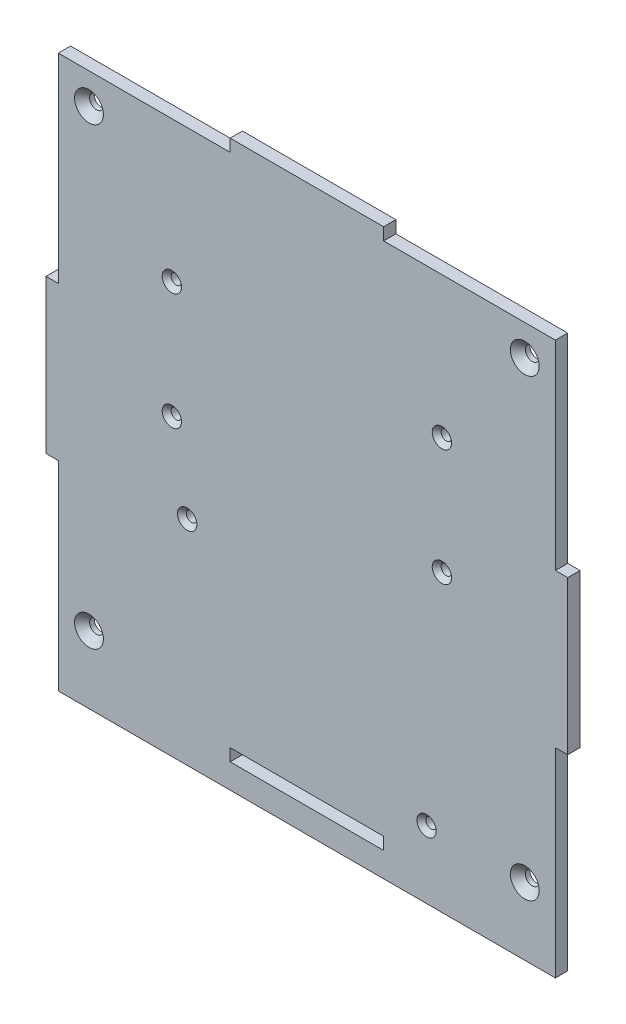
ISO-10303-21;
HEADER;
FILE_DESCRIPTION(('STEP AP214'),'2;1');
FILE_NAME('part.step','',(''),(''),'','','');
FILE_SCHEMA(('AUTOMOTIVE_DESIGN { 1 0 10303 214 1 1 1 1 }'));
ENDSEC;
DATA;
#1=APPLICATION_CONTEXT('core data for automotive mechanical design processes');
#2=APPLICATION_PROTOCOL_DEFINITION('international standard','automotive_design',2000,#1);
#3=PRODUCT_CONTEXT('',#1,'mechanical');
#4=PRODUCT('Part','Part','',(#3));
#5=PRODUCT_RELATED_PRODUCT_CATEGORY('part','',(#4));
#6=PRODUCT_DEFINITION_FORMATION('','',#4);
#7=PRODUCT_DEFINITION_CONTEXT('part definition',#1,'design');
#8=PRODUCT_DEFINITION('design','',#6,#7);
#9=PRODUCT_DEFINITION_SHAPE('','',#8);
#10=(LENGTH_UNIT() NAMED_UNIT(*) SI_UNIT(.MILLI.,.METRE.));
#11=(NAMED_UNIT(*) PLANE_ANGLE_UNIT() SI_UNIT($,.RADIAN.));
#12=(NAMED_UNIT(*) SI_UNIT($,.STERADIAN.) SOLID_ANGLE_UNIT());
#13=UNCERTAINTY_MEASURE_WITH_UNIT(LENGTH_MEASURE(1.E-05),#10,'distance_accuracy_value','');
#14=(GEOMETRIC_REPRESENTATION_CONTEXT(3) GLOBAL_UNCERTAINTY_ASSIGNED_CONTEXT((#13)) GLOBAL_UNIT_ASSIGNED_CONTEXT((#10,
#11,#12)) REPRESENTATION_CONTEXT('',''));
#15=CARTESIAN_POINT('',(0.,0.,0.));
#16=DIRECTION('',(0.,0.,1.));
#17=DIRECTION('',(1.,0.,0.));
#18=AXIS2_PLACEMENT_3D('',#15,#16,#17);
#19=CARTESIAN_POINT('',(0.,0.,4.));
#20=DIRECTION('',(0.,0.,1.));
#21=DIRECTION('',(1.,0.,0.));
#22=AXIS2_PLACEMENT_3D('',#19,#20,#21);
#23=PLANE('',#22);
#24=CARTESIAN_POINT('',(-39.,-10.5,4.));
#25=DIRECTION('',(0.,0.,1.));
#26=DIRECTION('',(1.,0.,0.));
#27=AXIS2_PLACEMENT_3D('',#24,#25,#26);
#28=CIRCLE('',#27,3.15);
#29=CARTESIAN_POINT('',(-35.85,-10.5,4.));
#30=VERTEX_POINT('',#29);
#31=EDGE_CURVE('E682',#30,#30,#28,.T.);
#32=ORIENTED_EDGE('',*,*,#31,.F.);
#33=EDGE_LOOP('',(#32));
#34=FACE_BOUND('',#33,.T.);
#35=CARTESIAN_POINT('',(39.,-58.,4.));
#36=DIRECTION('',(0.,0.,1.));
#37=DIRECTION('',(1.,0.,0.));
#38=AXIS2_PLACEMENT_3D('',#35,#36,#37);
#39=CIRCLE('',#38,3.15);
#40=CARTESIAN_POINT('',(42.15,-58.,4.));
#41=VERTEX_POINT('',#40);
#42=EDGE_CURVE('E673',#41,#41,#39,.T.);
#43=ORIENTED_EDGE('',*,*,#42,.F.);
#44=EDGE_LOOP('',(#43));
#45=FACE_BOUND('',#44,.T.);
#46=CARTESIAN_POINT('',(-71.,90.,4.));
#47=DIRECTION('',(0.,0.,1.));
#48=DIRECTION('',(1.,0.,0.));
#49=AXIS2_PLACEMENT_3D('',#46,#47,#48);
#50=CIRCLE('',#49,4.7);
#51=CARTESIAN_POINT('',(-66.3,90.,4.));
#52=VERTEX_POINT('',#51);
#53=EDGE_CURVE('E664',#52,#52,#50,.T.);
#54=ORIENTED_EDGE('',*,*,#53,.F.);
#55=EDGE_LOOP('',(#54));
#56=FACE_BOUND('',#55,.T.);
#57=CARTESIAN_POINT('',(71.,90.,4.));
#58=DIRECTION('',(0.,0.,1.));
#59=DIRECTION('',(1.,0.,0.));
#60=AXIS2_PLACEMENT_3D('',#57,#58,#59);
#61=CIRCLE('',#60,4.7);
#62=CARTESIAN_POINT('',(75.7,90.,4.));
#63=VERTEX_POINT('',#62);
#64=EDGE_CURVE('E655',#63,#63,#61,.T.);
#65=ORIENTED_EDGE('',*,*,#64,.F.);
#66=EDGE_LOOP('',(#65));
#67=FACE_BOUND('',#66,.T.);
#68=CARTESIAN_POINT('',(71.,-58.,4.));
#69=DIRECTION('',(0.,0.,1.));
#70=DIRECTION('',(1.,0.,0.));
#71=AXIS2_PLACEMENT_3D('',#68,#69,#70);
#72=CIRCLE('',#71,4.7);
#73=CARTESIAN_POINT('',(75.7,-58.,4.));
#74=VERTEX_POINT('',#73);
#75=EDGE_CURVE('E646',#74,#74,#72,.T.);
#76=ORIENTED_EDGE('',*,*,#75,.F.);
#77=EDGE_LOOP('',(#76));
#78=FACE_BOUND('',#77,.T.);
#79=CARTESIAN_POINT('',(-71.,-58.,4.));
#80=DIRECTION('',(0.,0.,1.));
#81=DIRECTION('',(1.,0.,0.));
#82=AXIS2_PLACEMENT_3D('',#79,#80,#81);
#83=CIRCLE('',#82,4.7);
#84=CARTESIAN_POINT('',(-66.3,-58.,4.));
#85=VERTEX_POINT('',#84);
#86=EDGE_CURVE('E637',#85,#85,#83,.T.);
#87=ORIENTED_EDGE('',*,*,#86,.F.);
#88=EDGE_LOOP('',(#87));
#89=FACE_BOUND('',#88,.T.);
#90=CARTESIAN_POINT('',(-44.,54.,4.));
#91=DIRECTION('',(0.,0.,1.));
#92=DIRECTION('',(1.,0.,0.));
#93=AXIS2_PLACEMENT_3D('',#90,#91,#92);
#94=CIRCLE('',#93,3.15);
#95=CARTESIAN_POINT('',(-40.85,54.,4.));
#96=VERTEX_POINT('',#95);
#97=EDGE_CURVE('E628',#96,#96,#94,.T.);
#98=ORIENTED_EDGE('',*,*,#97,.F.);
#99=EDGE_LOOP('',(#98));
#100=FACE_BOUND('',#99,.T.);
#101=CARTESIAN_POINT('',(44.,54.,4.));
#102=DIRECTION('',(0.,0.,1.));
#103=DIRECTION('',(1.,0.,0.));
#104=AXIS2_PLACEMENT_3D('',#101,#102,#103);
#105=CIRCLE('',#104,3.15);
#106=CARTESIAN_POINT('',(47.15,54.,4.));
#107=VERTEX_POINT('',#106);
#108=EDGE_CURVE('E619',#107,#107,#105,.T.);
#109=ORIENTED_EDGE('',*,*,#108,.F.);
#110=EDGE_LOOP('',(#109));
#111=FACE_BOUND('',#110,.T.);
#112=CARTESIAN_POINT('',(44.,16.,4.));
#113=DIRECTION('',(0.,0.,1.));
#114=DIRECTION('',(1.,0.,0.));
#115=AXIS2_PLACEMENT_3D('',#112,#113,#114);
#116=CIRCLE('',#115,3.15);
#117=CARTESIAN_POINT('',(47.15,16.,4.));
#118=VERTEX_POINT('',#117);
#119=EDGE_CURVE('E610',#118,#118,#116,.T.);
#120=ORIENTED_EDGE('',*,*,#119,.F.);
#121=EDGE_LOOP('',(#120));
#122=FACE_BOUND('',#121,.T.);
#123=CARTESIAN_POINT('',(-44.,16.,4.));
#124=DIRECTION('',(0.,0.,1.));
#125=DIRECTION('',(1.,0.,0.));
#126=AXIS2_PLACEMENT_3D('',#123,#124,#125);
#127=CIRCLE('',#126,3.15);
#128=CARTESIAN_POINT('',(-40.85,16.,4.));
#129=VERTEX_POINT('',#128);
#130=EDGE_CURVE('E601',#129,#129,#127,.T.);
#131=ORIENTED_EDGE('',*,*,#130,.F.);
#132=EDGE_LOOP('',(#131));
#133=FACE_BOUND('',#132,.T.);
#134=DIRECTION('',(1.,0.,0.));
#135=VECTOR('',#134,1.);
#136=CARTESIAN_POINT('',(0.,-80.,4.));
#137=LINE('',#136,#135);
#138=CARTESIAN_POINT('',(-81.,-80.,4.));
#139=VERTEX_POINT('',#138);
#140=CARTESIAN_POINT('',(81.,-80.,4.));
#141=VERTEX_POINT('',#140);
#142=EDGE_CURVE('E207',#139,#141,#137,.T.);
#143=ORIENTED_EDGE('',*,*,#142,.T.);
#144=DIRECTION('',(0.,1.,0.));
#145=VECTOR('',#144,1.);
#146=CARTESIAN_POINT('',(81.,0.,4.));
#147=LINE('',#146,#145);
#148=CARTESIAN_POINT('',(81.,-15.,4.));
#149=VERTEX_POINT('',#148);
#150=EDGE_CURVE('E210',#141,#149,#147,.T.);
#151=ORIENTED_EDGE('',*,*,#150,.T.);
#152=DIRECTION('',(1.,0.,0.));
#153=VECTOR('',#152,1.);
#154=CARTESIAN_POINT('',(0.,-15.0000000000001,4.));
#155=LINE('',#154,#153);
#156=CARTESIAN_POINT('',(85.,-15.,4.));
#157=VERTEX_POINT('',#156);
#158=EDGE_CURVE('E213',#149,#157,#155,.T.);
#159=ORIENTED_EDGE('',*,*,#158,.T.);
#160=DIRECTION('',(0.,-1.,0.));
#161=VECTOR('',#160,1.);
#162=CARTESIAN_POINT('',(85.,0.,4.));
#163=LINE('',#162,#161);
#164=CARTESIAN_POINT('',(85.,35.,4.));
#165=VERTEX_POINT('',#164);
#166=EDGE_CURVE('E216',#165,#157,#163,.T.);
#167=ORIENTED_EDGE('',*,*,#166,.F.);
#168=DIRECTION('',(1.,0.,0.));
#169=VECTOR('',#168,1.);
#170=CARTESIAN_POINT('',(0.,35.0000000000001,4.));
#171=LINE('',#170,#169);
#172=CARTESIAN_POINT('',(81.,35.,4.));
#173=VERTEX_POINT('',#172);
#174=EDGE_CURVE('E219',#173,#165,#171,.T.);
#175=ORIENTED_EDGE('',*,*,#174,.F.);
#176=CARTESIAN_POINT('',(81.,100.,4.));
#177=VERTEX_POINT('',#176);
#178=EDGE_CURVE('E214',#173,#177,#147,.T.);
#179=ORIENTED_EDGE('',*,*,#178,.T.);
#180=DIRECTION('',(1.,0.,0.));
#181=VECTOR('',#180,1.);
#182=CARTESIAN_POINT('',(0.,100.,4.));
#183=LINE('',#182,#181);
#184=CARTESIAN_POINT('',(25.,100.,4.));
#185=VERTEX_POINT('',#184);
#186=EDGE_CURVE('E222',#185,#177,#183,.T.);
#187=ORIENTED_EDGE('',*,*,#186,.F.);
#188=DIRECTION('',(0.,1.,0.));
#189=VECTOR('',#188,1.);
#190=CARTESIAN_POINT('',(25.,0.,4.));
#191=LINE('',#190,#189);
#192=CARTESIAN_POINT('',(25.,104.,4.));
#193=VERTEX_POINT('',#192);
#194=EDGE_CURVE('E225',#185,#193,#191,.T.);
#195=ORIENTED_EDGE('',*,*,#194,.T.);
#196=DIRECTION('',(1.,0.,0.));
#197=VECTOR('',#196,1.);
#198=CARTESIAN_POINT('',(0.,104.,4.));
#199=LINE('',#198,#197);
#200=CARTESIAN_POINT('',(-25.,104.,4.));
#201=VERTEX_POINT('',#200);
#202=EDGE_CURVE('E228',#201,#193,#199,.T.);
#203=ORIENTED_EDGE('',*,*,#202,.F.);
#204=DIRECTION('',(0.,1.,0.));
#205=VECTOR('',#204,1.);
#206=CARTESIAN_POINT('',(-25.,0.,4.));
#207=LINE('',#206,#205);
#208=CARTESIAN_POINT('',(-25.,100.,4.));
#209=VERTEX_POINT('',#208);
#210=EDGE_CURVE('E231',#209,#201,#207,.T.);
#211=ORIENTED_EDGE('',*,*,#210,.F.);
#212=CARTESIAN_POINT('',(-81.,100.,4.));
#213=VERTEX_POINT('',#212);
#214=EDGE_CURVE('E226',#213,#209,#183,.T.);
#215=ORIENTED_EDGE('',*,*,#214,.F.);
#216=DIRECTION('',(0.,1.,0.));
#217=VECTOR('',#216,1.);
#218=CARTESIAN_POINT('',(-81.,0.,4.));
#219=LINE('',#218,#217);
#220=CARTESIAN_POINT('',(-81.,35.,4.));
#221=VERTEX_POINT('',#220);
#222=EDGE_CURVE('E234',#221,#213,#219,.T.);
#223=ORIENTED_EDGE('',*,*,#222,.F.);
#224=DIRECTION('',(-1.,0.,0.));
#225=VECTOR('',#224,1.);
#226=CARTESIAN_POINT('',(0.,35.,4.));
#227=LINE('',#226,#225);
#228=CARTESIAN_POINT('',(-85.,35.,4.));
#229=VERTEX_POINT('',#228);
#230=EDGE_CURVE('E237',#221,#229,#227,.T.);
#231=ORIENTED_EDGE('',*,*,#230,.T.);
#232=DIRECTION('',(0.,-1.,0.));
#233=VECTOR('',#232,1.);
#234=CARTESIAN_POINT('',(-85.,0.,4.));
#235=LINE('',#234,#233);
#236=CARTESIAN_POINT('',(-85.,-15.,4.));
#237=VERTEX_POINT('',#236);
#238=EDGE_CURVE('E240',#229,#237,#235,.T.);
#239=ORIENTED_EDGE('',*,*,#238,.T.);
#240=DIRECTION('',(-1.,0.,0.));
#241=VECTOR('',#240,1.);
#242=CARTESIAN_POINT('',(0.,-15.0000000000001,4.));
#243=LINE('',#242,#241);
#244=CARTESIAN_POINT('',(-81.,-15.,4.));
#245=VERTEX_POINT('',#244);
#246=EDGE_CURVE('E242',#245,#237,#243,.T.);
#247=ORIENTED_EDGE('',*,*,#246,.F.);
#248=EDGE_CURVE('E238',#139,#245,#219,.T.);
#249=ORIENTED_EDGE('',*,*,#248,.F.);
#250=EDGE_LOOP('',(#143,#151,#159,#167,#175,#179,#187,#195,#203,#211,#215,#223,#231,#239,#247,#249));
#251=FACE_BOUND('',#250,.T.);
#252=DIRECTION('',(1.,0.,0.));
#253=VECTOR('',#252,1.);
#254=CARTESIAN_POINT('',(-25.,-72.,4.));
#255=LINE('',#254,#253);
#256=CARTESIAN_POINT('',(-25.,-72.,4.));
#257=VERTEX_POINT('',#256);
#258=CARTESIAN_POINT('',(25.,-72.,4.));
#259=VERTEX_POINT('',#258);
#260=EDGE_CURVE('E179',#257,#259,#255,.T.);
#261=ORIENTED_EDGE('',*,*,#260,.F.);
#262=DIRECTION('',(0.,1.,0.));
#263=VECTOR('',#262,1.);
#264=CARTESIAN_POINT('',(-25.,-72.,4.));
#265=LINE('',#264,#263);
#266=CARTESIAN_POINT('',(-25.,-68.,4.));
#267=VERTEX_POINT('',#266);
#268=EDGE_CURVE('E49',#257,#267,#265,.T.);
#269=ORIENTED_EDGE('',*,*,#268,.T.);
#270=DIRECTION('',(1.,0.,0.));
#271=VECTOR('',#270,1.);
#272=CARTESIAN_POINT('',(-25.,-68.,4.));
#273=LINE('',#272,#271);
#274=CARTESIAN_POINT('',(25.,-68.,4.));
#275=VERTEX_POINT('',#274);
#276=EDGE_CURVE('E192',#267,#275,#273,.T.);
#277=ORIENTED_EDGE('',*,*,#276,.T.);
#278=DIRECTION('',(0.,1.,0.));
#279=VECTOR('',#278,1.);
#280=CARTESIAN_POINT('',(25.,-72.,4.));
#281=LINE('',#280,#279);
#282=EDGE_CURVE('E199',#259,#275,#281,.T.);
#283=ORIENTED_EDGE('',*,*,#282,.F.);
#284=EDGE_LOOP('',(#261,#269,#277,#283));
#285=FACE_BOUND('',#284,.T.);
#286=ADVANCED_FACE('F34',(#34,#45,#56,#67,#78,#89,#100,#111,#122,#133,#251,#285),#23,.T.);
#287=CARTESIAN_POINT('',(0.,0.,0.));
#288=DIRECTION('',(0.,0.,1.));
#289=DIRECTION('',(1.,0.,0.));
#290=AXIS2_PLACEMENT_3D('',#287,#288,#289);
#291=PLANE('',#290);
#292=CARTESIAN_POINT('',(-39.,-10.5,0.));
#293=DIRECTION('',(0.,0.,1.));
#294=DIRECTION('',(1.,0.,0.));
#295=AXIS2_PLACEMENT_3D('',#292,#293,#294);
#296=CIRCLE('',#295,1.69999999999999);
#297=CARTESIAN_POINT('',(-37.3,-10.5,0.));
#298=VERTEX_POINT('',#297);
#299=EDGE_CURVE('E676',#298,#298,#296,.T.);
#300=ORIENTED_EDGE('',*,*,#299,.T.);
#301=EDGE_LOOP('',(#300));
#302=FACE_BOUND('',#301,.T.);
#303=CARTESIAN_POINT('',(39.,-58.,0.));
#304=DIRECTION('',(0.,0.,1.));
#305=DIRECTION('',(1.,0.,0.));
#306=AXIS2_PLACEMENT_3D('',#303,#304,#305);
#307=CIRCLE('',#306,1.69999999999999);
#308=CARTESIAN_POINT('',(40.7,-58.,0.));
#309=VERTEX_POINT('',#308);
#310=EDGE_CURVE('E667',#309,#309,#307,.T.);
#311=ORIENTED_EDGE('',*,*,#310,.T.);
#312=EDGE_LOOP('',(#311));
#313=FACE_BOUND('',#312,.T.);
#314=CARTESIAN_POINT('',(-71.,90.,0.));
#315=DIRECTION('',(0.,0.,1.));
#316=DIRECTION('',(1.,0.,0.));
#317=AXIS2_PLACEMENT_3D('',#314,#315,#316);
#318=CIRCLE('',#317,2.25);
#319=CARTESIAN_POINT('',(-68.75,90.,0.));
#320=VERTEX_POINT('',#319);
#321=EDGE_CURVE('E658',#320,#320,#318,.T.);
#322=ORIENTED_EDGE('',*,*,#321,.T.);
#323=EDGE_LOOP('',(#322));
#324=FACE_BOUND('',#323,.T.);
#325=CARTESIAN_POINT('',(71.,90.,0.));
#326=DIRECTION('',(0.,0.,1.));
#327=DIRECTION('',(1.,0.,0.));
#328=AXIS2_PLACEMENT_3D('',#325,#326,#327);
#329=CIRCLE('',#328,2.25);
#330=CARTESIAN_POINT('',(73.25,90.,0.));
#331=VERTEX_POINT('',#330);
#332=EDGE_CURVE('E649',#331,#331,#329,.T.);
#333=ORIENTED_EDGE('',*,*,#332,.T.);
#334=EDGE_LOOP('',(#333));
#335=FACE_BOUND('',#334,.T.);
#336=CARTESIAN_POINT('',(71.,-58.,0.));
#337=DIRECTION('',(0.,0.,1.));
#338=DIRECTION('',(1.,0.,0.));
#339=AXIS2_PLACEMENT_3D('',#336,#337,#338);
#340=CIRCLE('',#339,2.25);
#341=CARTESIAN_POINT('',(73.25,-58.,0.));
#342=VERTEX_POINT('',#341);
#343=EDGE_CURVE('E640',#342,#342,#340,.T.);
#344=ORIENTED_EDGE('',*,*,#343,.T.);
#345=EDGE_LOOP('',(#344));
#346=FACE_BOUND('',#345,.T.);
#347=CARTESIAN_POINT('',(-71.,-58.,0.));
#348=DIRECTION('',(0.,0.,1.));
#349=DIRECTION('',(1.,0.,0.));
#350=AXIS2_PLACEMENT_3D('',#347,#348,#349);
#351=CIRCLE('',#350,2.25);
#352=CARTESIAN_POINT('',(-68.75,-58.,0.));
#353=VERTEX_POINT('',#352);
#354=EDGE_CURVE('E631',#353,#353,#351,.T.);
#355=ORIENTED_EDGE('',*,*,#354,.T.);
#356=EDGE_LOOP('',(#355));
#357=FACE_BOUND('',#356,.T.);
#358=CARTESIAN_POINT('',(-44.,54.,0.));
#359=DIRECTION('',(0.,0.,1.));
#360=DIRECTION('',(1.,0.,0.));
#361=AXIS2_PLACEMENT_3D('',#358,#359,#360);
#362=CIRCLE('',#361,1.7);
#363=CARTESIAN_POINT('',(-42.3,54.,0.));
#364=VERTEX_POINT('',#363);
#365=EDGE_CURVE('E622',#364,#364,#362,.T.);
#366=ORIENTED_EDGE('',*,*,#365,.T.);
#367=EDGE_LOOP('',(#366));
#368=FACE_BOUND('',#367,.T.);
#369=CARTESIAN_POINT('',(44.,54.,0.));
#370=DIRECTION('',(0.,0.,1.));
#371=DIRECTION('',(1.,0.,0.));
#372=AXIS2_PLACEMENT_3D('',#369,#370,#371);
#373=CIRCLE('',#372,1.7);
#374=CARTESIAN_POINT('',(45.7,54.,0.));
#375=VERTEX_POINT('',#374);
#376=EDGE_CURVE('E613',#375,#375,#373,.T.);
#377=ORIENTED_EDGE('',*,*,#376,.T.);
#378=EDGE_LOOP('',(#377));
#379=FACE_BOUND('',#378,.T.);
#380=CARTESIAN_POINT('',(44.,16.,0.));
#381=DIRECTION('',(0.,0.,1.));
#382=DIRECTION('',(1.,0.,0.));
#383=AXIS2_PLACEMENT_3D('',#380,#381,#382);
#384=CIRCLE('',#383,1.7);
#385=CARTESIAN_POINT('',(45.7,16.,0.));
#386=VERTEX_POINT('',#385);
#387=EDGE_CURVE('E604',#386,#386,#384,.T.);
#388=ORIENTED_EDGE('',*,*,#387,.T.);
#389=EDGE_LOOP('',(#388));
#390=FACE_BOUND('',#389,.T.);
#391=CARTESIAN_POINT('',(-44.,16.,0.));
#392=DIRECTION('',(0.,0.,1.));
#393=DIRECTION('',(1.,0.,0.));
#394=AXIS2_PLACEMENT_3D('',#391,#392,#393);
#395=CIRCLE('',#394,1.7);
#396=CARTESIAN_POINT('',(-42.3,16.,0.));
#397=VERTEX_POINT('',#396);
#398=EDGE_CURVE('E594',#397,#397,#395,.T.);
#399=ORIENTED_EDGE('',*,*,#398,.T.);
#400=EDGE_LOOP('',(#399));
#401=FACE_BOUND('',#400,.T.);
#402=DIRECTION('',(1.,0.,0.));
#403=VECTOR('',#402,1.);
#404=CARTESIAN_POINT('',(0.,-80.,0.));
#405=LINE('',#404,#403);
#406=CARTESIAN_POINT('',(-81.,-80.,0.));
#407=VERTEX_POINT('',#406);
#408=CARTESIAN_POINT('',(81.,-80.,0.));
#409=VERTEX_POINT('',#408);
#410=EDGE_CURVE('E185',#407,#409,#405,.T.);
#411=ORIENTED_EDGE('',*,*,#410,.F.);
#412=DIRECTION('',(0.,1.,0.));
#413=VECTOR('',#412,1.);
#414=CARTESIAN_POINT('',(-81.,0.,0.));
#415=LINE('',#414,#413);
#416=CARTESIAN_POINT('',(-81.,-15.,0.));
#417=VERTEX_POINT('',#416);
#418=EDGE_CURVE('E211',#407,#417,#415,.T.);
#419=ORIENTED_EDGE('',*,*,#418,.T.);
#420=DIRECTION('',(-1.,0.,0.));
#421=VECTOR('',#420,1.);
#422=CARTESIAN_POINT('',(0.,-15.0000000000001,0.));
#423=LINE('',#422,#421);
#424=CARTESIAN_POINT('',(-85.,-15.,0.));
#425=VERTEX_POINT('',#424);
#426=EDGE_CURVE('E280',#417,#425,#423,.T.);
#427=ORIENTED_EDGE('',*,*,#426,.T.);
#428=DIRECTION('',(0.,-1.,0.));
#429=VECTOR('',#428,1.);
#430=CARTESIAN_POINT('',(-85.,0.,0.));
#431=LINE('',#430,#429);
#432=CARTESIAN_POINT('',(-85.,35.,0.));
#433=VERTEX_POINT('',#432);
#434=EDGE_CURVE('E277',#433,#425,#431,.T.);
#435=ORIENTED_EDGE('',*,*,#434,.F.);
#436=DIRECTION('',(-1.,0.,0.));
#437=VECTOR('',#436,1.);
#438=CARTESIAN_POINT('',(0.,35.,0.));
#439=LINE('',#438,#437);
#440=CARTESIAN_POINT('',(-81.,35.,0.));
#441=VERTEX_POINT('',#440);
#442=EDGE_CURVE('E275',#441,#433,#439,.T.);
#443=ORIENTED_EDGE('',*,*,#442,.F.);
#444=CARTESIAN_POINT('',(-81.,100.,0.));
#445=VERTEX_POINT('',#444);
#446=EDGE_CURVE('E272',#441,#445,#415,.T.);
#447=ORIENTED_EDGE('',*,*,#446,.T.);
#448=DIRECTION('',(1.,0.,0.));
#449=VECTOR('',#448,1.);
#450=CARTESIAN_POINT('',(0.,100.,0.));
#451=LINE('',#450,#449);
#452=CARTESIAN_POINT('',(-25.,100.,0.));
#453=VERTEX_POINT('',#452);
#454=EDGE_CURVE('E263',#445,#453,#451,.T.);
#455=ORIENTED_EDGE('',*,*,#454,.T.);
#456=DIRECTION('',(0.,1.,0.));
#457=VECTOR('',#456,1.);
#458=CARTESIAN_POINT('',(-25.,0.,0.));
#459=LINE('',#458,#457);
#460=CARTESIAN_POINT('',(-25.,104.,0.));
#461=VERTEX_POINT('',#460);
#462=EDGE_CURVE('E269',#453,#461,#459,.T.);
#463=ORIENTED_EDGE('',*,*,#462,.T.);
#464=DIRECTION('',(1.,0.,0.));
#465=VECTOR('',#464,1.);
#466=CARTESIAN_POINT('',(0.,104.,0.));
#467=LINE('',#466,#465);
#468=CARTESIAN_POINT('',(25.,104.,0.));
#469=VERTEX_POINT('',#468);
#470=EDGE_CURVE('E266',#461,#469,#467,.T.);
#471=ORIENTED_EDGE('',*,*,#470,.T.);
#472=DIRECTION('',(0.,1.,0.));
#473=VECTOR('',#472,1.);
#474=CARTESIAN_POINT('',(25.,0.,0.));
#475=LINE('',#474,#473);
#476=CARTESIAN_POINT('',(25.,100.,0.));
#477=VERTEX_POINT('',#476);
#478=EDGE_CURVE('E262',#477,#469,#475,.T.);
#479=ORIENTED_EDGE('',*,*,#478,.F.);
#480=CARTESIAN_POINT('',(81.,100.,0.));
#481=VERTEX_POINT('',#480);
#482=EDGE_CURVE('E259',#477,#481,#451,.T.);
#483=ORIENTED_EDGE('',*,*,#482,.T.);
#484=DIRECTION('',(0.,1.,0.));
#485=VECTOR('',#484,1.);
#486=CARTESIAN_POINT('',(81.,0.,0.));
#487=LINE('',#486,#485);
#488=CARTESIAN_POINT('',(81.,35.,0.));
#489=VERTEX_POINT('',#488);
#490=EDGE_CURVE('E250',#489,#481,#487,.T.);
#491=ORIENTED_EDGE('',*,*,#490,.F.);
#492=DIRECTION('',(1.,0.,0.));
#493=VECTOR('',#492,1.);
#494=CARTESIAN_POINT('',(0.,35.0000000000001,0.));
#495=LINE('',#494,#493);
#496=CARTESIAN_POINT('',(85.,35.,0.));
#497=VERTEX_POINT('',#496);
#498=EDGE_CURVE('E256',#489,#497,#495,.T.);
#499=ORIENTED_EDGE('',*,*,#498,.T.);
#500=DIRECTION('',(0.,-1.,0.));
#501=VECTOR('',#500,1.);
#502=CARTESIAN_POINT('',(85.,0.,0.));
#503=LINE('',#502,#501);
#504=CARTESIAN_POINT('',(85.,-15.,0.));
#505=VERTEX_POINT('',#504);
#506=EDGE_CURVE('E253',#497,#505,#503,.T.);
#507=ORIENTED_EDGE('',*,*,#506,.T.);
#508=DIRECTION('',(1.,0.,0.));
#509=VECTOR('',#508,1.);
#510=CARTESIAN_POINT('',(0.,-15.0000000000001,0.));
#511=LINE('',#510,#509);
#512=CARTESIAN_POINT('',(81.,-15.,0.));
#513=VERTEX_POINT('',#512);
#514=EDGE_CURVE('E249',#513,#505,#511,.T.);
#515=ORIENTED_EDGE('',*,*,#514,.F.);
#516=EDGE_CURVE('E247',#409,#513,#487,.T.);
#517=ORIENTED_EDGE('',*,*,#516,.F.);
#518=EDGE_LOOP('',(#411,#419,#427,#435,#443,#447,#455,#463,#471,#479,#483,#491,#499,#507,#515,#517));
#519=FACE_BOUND('',#518,.T.);
#520=DIRECTION('',(0.,-1.,0.));
#521=VECTOR('',#520,1.);
#522=CARTESIAN_POINT('',(-25.,-72.,0.));
#523=LINE('',#522,#521);
#524=CARTESIAN_POINT('',(-25.,-68.,0.));
#525=VERTEX_POINT('',#524);
#526=CARTESIAN_POINT('',(-25.,-72.,0.));
#527=VERTEX_POINT('',#526);
#528=EDGE_CURVE('E173',#525,#527,#523,.T.);
#529=ORIENTED_EDGE('',*,*,#528,.T.);
#530=DIRECTION('',(-1.,0.,0.));
#531=VECTOR('',#530,1.);
#532=CARTESIAN_POINT('',(-25.,-72.,0.));
#533=LINE('',#532,#531);
#534=CARTESIAN_POINT('',(25.,-72.,0.));
#535=VERTEX_POINT('',#534);
#536=EDGE_CURVE('E182',#535,#527,#533,.T.);
#537=ORIENTED_EDGE('',*,*,#536,.F.);
#538=DIRECTION('',(0.,-1.,0.));
#539=VECTOR('',#538,1.);
#540=CARTESIAN_POINT('',(25.,-72.,0.));
#541=LINE('',#540,#539);
#542=CARTESIAN_POINT('',(25.,-68.,0.));
#543=VERTEX_POINT('',#542);
#544=EDGE_CURVE('E57',#543,#535,#541,.T.);
#545=ORIENTED_EDGE('',*,*,#544,.F.);
#546=DIRECTION('',(-1.,0.,0.));
#547=VECTOR('',#546,1.);
#548=CARTESIAN_POINT('',(-25.,-68.,0.));
#549=LINE('',#548,#547);
#550=EDGE_CURVE('E190',#543,#525,#549,.T.);
#551=ORIENTED_EDGE('',*,*,#550,.T.);
#552=EDGE_LOOP('',(#529,#537,#545,#551));
#553=FACE_BOUND('',#552,.T.);
#554=ADVANCED_FACE('F188',(#302,#313,#324,#335,#346,#357,#368,#379,#390,#401,#519,#553),#291,.F.);
#555=CARTESIAN_POINT('',(0.,-80.,4.));
#556=DIRECTION('',(0.,1.,0.));
#557=DIRECTION('',(0.,0.,1.));
#558=AXIS2_PLACEMENT_3D('',#555,#556,#557);
#559=PLANE('',#558);
#560=ORIENTED_EDGE('',*,*,#410,.T.);
#561=DIRECTION('',(0.,0.,-1.));
#562=VECTOR('',#561,1.);
#563=CARTESIAN_POINT('',(81.,-80.,4.));
#564=LINE('',#563,#562);
#565=EDGE_CURVE('E11',#141,#409,#564,.T.);
#566=ORIENTED_EDGE('',*,*,#565,.F.);
#567=ORIENTED_EDGE('',*,*,#142,.F.);
#568=DIRECTION('',(0.,0.,-1.));
#569=VECTOR('',#568,1.);
#570=CARTESIAN_POINT('',(-81.,-80.,4.));
#571=LINE('',#570,#569);
#572=EDGE_CURVE('E283',#139,#407,#571,.T.);
#573=ORIENTED_EDGE('',*,*,#572,.T.);
#574=EDGE_LOOP('',(#560,#566,#567,#573));
#575=FACE_BOUND('',#574,.T.);
#576=ADVANCED_FACE('F36',(#575),#559,.F.);
#577=CARTESIAN_POINT('',(81.,0.,4.));
#578=DIRECTION('',(-1.,0.,0.));
#579=DIRECTION('',(0.,0.,1.));
#580=AXIS2_PLACEMENT_3D('',#577,#578,#579);
#581=PLANE('',#580);
#582=ORIENTED_EDGE('',*,*,#516,.T.);
#583=DIRECTION('',(0.,0.,-1.));
#584=VECTOR('',#583,1.);
#585=CARTESIAN_POINT('',(81.,-15.,4.));
#586=LINE('',#585,#584);
#587=EDGE_CURVE('E42',#149,#513,#586,.T.);
#588=ORIENTED_EDGE('',*,*,#587,.F.);
#589=ORIENTED_EDGE('',*,*,#150,.F.);
#590=ORIENTED_EDGE('',*,*,#565,.T.);
#591=EDGE_LOOP('',(#582,#588,#589,#590));
#592=FACE_BOUND('',#591,.T.);
#593=ADVANCED_FACE('F387',(#592),#581,.F.);
#594=CARTESIAN_POINT('',(0.,-15.0000000000001,4.));
#595=DIRECTION('',(0.,1.,0.));
#596=DIRECTION('',(-1.,0.,0.));
#597=AXIS2_PLACEMENT_3D('',#594,#595,#596);
#598=PLANE('',#597);
#599=ORIENTED_EDGE('',*,*,#514,.T.);
#600=DIRECTION('',(0.,0.,-1.));
#601=VECTOR('',#600,1.);
#602=CARTESIAN_POINT('',(85.,-15.,4.));
#603=LINE('',#602,#601);
#604=EDGE_CURVE('E310',#157,#505,#603,.T.);
#605=ORIENTED_EDGE('',*,*,#604,.F.);
#606=ORIENTED_EDGE('',*,*,#158,.F.);
#607=ORIENTED_EDGE('',*,*,#587,.T.);
#608=EDGE_LOOP('',(#599,#605,#606,#607));
#609=FACE_BOUND('',#608,.T.);
#610=ADVANCED_FACE('F316',(#609),#598,.F.);
#611=CARTESIAN_POINT('',(85.,0.,4.));
#612=DIRECTION('',(1.,0.,0.));
#613=DIRECTION('',(0.,0.,-1.));
#614=AXIS2_PLACEMENT_3D('',#611,#612,#613);
#615=PLANE('',#614);
#616=ORIENTED_EDGE('',*,*,#506,.F.);
#617=DIRECTION('',(0.,0.,-1.));
#618=VECTOR('',#617,1.);
#619=CARTESIAN_POINT('',(85.,35.,4.));
#620=LINE('',#619,#618);
#621=EDGE_CURVE('E308',#165,#497,#620,.T.);
#622=ORIENTED_EDGE('',*,*,#621,.F.);
#623=ORIENTED_EDGE('',*,*,#166,.T.);
#624=ORIENTED_EDGE('',*,*,#604,.T.);
#625=EDGE_LOOP('',(#616,#622,#623,#624));
#626=FACE_BOUND('',#625,.T.);
#627=ADVANCED_FACE('F325',(#626),#615,.T.);
#628=CARTESIAN_POINT('',(0.,35.0000000000001,4.));
#629=DIRECTION('',(0.,1.,0.));
#630=DIRECTION('',(-1.,0.,0.));
#631=AXIS2_PLACEMENT_3D('',#628,#629,#630);
#632=PLANE('',#631);
#633=ORIENTED_EDGE('',*,*,#498,.F.);
#634=DIRECTION('',(0.,0.,-1.));
#635=VECTOR('',#634,1.);
#636=CARTESIAN_POINT('',(81.,35.,4.));
#637=LINE('',#636,#635);
#638=EDGE_CURVE('E306',#173,#489,#637,.T.);
#639=ORIENTED_EDGE('',*,*,#638,.F.);
#640=ORIENTED_EDGE('',*,*,#174,.T.);
#641=ORIENTED_EDGE('',*,*,#621,.T.);
#642=EDGE_LOOP('',(#633,#639,#640,#641));
#643=FACE_BOUND('',#642,.T.);
#644=ADVANCED_FACE('F331',(#643),#632,.T.);
#645=ORIENTED_EDGE('',*,*,#490,.T.);
#646=DIRECTION('',(0.,0.,-1.));
#647=VECTOR('',#646,1.);
#648=CARTESIAN_POINT('',(81.,100.,4.));
#649=LINE('',#648,#647);
#650=EDGE_CURVE('E304',#177,#481,#649,.T.);
#651=ORIENTED_EDGE('',*,*,#650,.F.);
#652=ORIENTED_EDGE('',*,*,#178,.F.);
#653=ORIENTED_EDGE('',*,*,#638,.T.);
#654=EDGE_LOOP('',(#645,#651,#652,#653));
#655=FACE_BOUND('',#654,.T.);
#656=ADVANCED_FACE('F336',(#655),#581,.F.);
#657=CARTESIAN_POINT('',(0.,100.,4.));
#658=DIRECTION('',(0.,1.,0.));
#659=DIRECTION('',(0.,0.,1.));
#660=AXIS2_PLACEMENT_3D('',#657,#658,#659);
#661=PLANE('',#660);
#662=ORIENTED_EDGE('',*,*,#482,.F.);
#663=DIRECTION('',(0.,0.,-1.));
#664=VECTOR('',#663,1.);
#665=CARTESIAN_POINT('',(25.,100.,4.));
#666=LINE('',#665,#664);
#667=EDGE_CURVE('E302',#185,#477,#666,.T.);
#668=ORIENTED_EDGE('',*,*,#667,.F.);
#669=ORIENTED_EDGE('',*,*,#186,.T.);
#670=ORIENTED_EDGE('',*,*,#650,.T.);
#671=EDGE_LOOP('',(#662,#668,#669,#670));
#672=FACE_BOUND('',#671,.T.);
#673=ADVANCED_FACE('F343',(#672),#661,.T.);
#674=CARTESIAN_POINT('',(25.,0.,4.));
#675=DIRECTION('',(-1.,0.,0.));
#676=DIRECTION('',(0.,0.,1.));
#677=AXIS2_PLACEMENT_3D('',#674,#675,#676);
#678=PLANE('',#677);
#679=ORIENTED_EDGE('',*,*,#478,.T.);
#680=DIRECTION('',(0.,0.,-1.));
#681=VECTOR('',#680,1.);
#682=CARTESIAN_POINT('',(25.,104.,4.));
#683=LINE('',#682,#681);
#684=EDGE_CURVE('E300',#193,#469,#683,.T.);
#685=ORIENTED_EDGE('',*,*,#684,.F.);
#686=ORIENTED_EDGE('',*,*,#194,.F.);
#687=ORIENTED_EDGE('',*,*,#667,.T.);
#688=EDGE_LOOP('',(#679,#685,#686,#687));
#689=FACE_BOUND('',#688,.T.);
#690=ADVANCED_FACE('F346',(#689),#678,.F.);
#691=CARTESIAN_POINT('',(0.,104.,4.));
#692=DIRECTION('',(0.,1.,0.));
#693=DIRECTION('',(0.,0.,1.));
#694=AXIS2_PLACEMENT_3D('',#691,#692,#693);
#695=PLANE('',#694);
#696=ORIENTED_EDGE('',*,*,#470,.F.);
#697=DIRECTION('',(0.,0.,-1.));
#698=VECTOR('',#697,1.);
#699=CARTESIAN_POINT('',(-25.,104.,4.));
#700=LINE('',#699,#698);
#701=EDGE_CURVE('E298',#201,#461,#700,.T.);
#702=ORIENTED_EDGE('',*,*,#701,.F.);
#703=ORIENTED_EDGE('',*,*,#202,.T.);
#704=ORIENTED_EDGE('',*,*,#684,.T.);
#705=EDGE_LOOP('',(#696,#702,#703,#704));
#706=FACE_BOUND('',#705,.T.);
#707=ADVANCED_FACE('F349',(#706),#695,.T.);
#708=CARTESIAN_POINT('',(-25.,0.,4.));
#709=DIRECTION('',(-1.,0.,0.));
#710=DIRECTION('',(0.,0.,1.));
#711=AXIS2_PLACEMENT_3D('',#708,#709,#710);
#712=PLANE('',#711);
#713=ORIENTED_EDGE('',*,*,#462,.F.);
#714=DIRECTION('',(0.,0.,-1.));
#715=VECTOR('',#714,1.);
#716=CARTESIAN_POINT('',(-25.,100.,4.));
#717=LINE('',#716,#715);
#718=EDGE_CURVE('E296',#209,#453,#717,.T.);
#719=ORIENTED_EDGE('',*,*,#718,.F.);
#720=ORIENTED_EDGE('',*,*,#210,.T.);
#721=ORIENTED_EDGE('',*,*,#701,.T.);
#722=EDGE_LOOP('',(#713,#719,#720,#721));
#723=FACE_BOUND('',#722,.T.);
#724=ADVANCED_FACE('F355',(#723),#712,.T.);
#725=ORIENTED_EDGE('',*,*,#454,.F.);
#726=DIRECTION('',(0.,0.,-1.));
#727=VECTOR('',#726,1.);
#728=CARTESIAN_POINT('',(-81.,100.,4.));
#729=LINE('',#728,#727);
#730=EDGE_CURVE('E294',#213,#445,#729,.T.);
#731=ORIENTED_EDGE('',*,*,#730,.F.);
#732=ORIENTED_EDGE('',*,*,#214,.T.);
#733=ORIENTED_EDGE('',*,*,#718,.T.);
#734=EDGE_LOOP('',(#725,#731,#732,#733));
#735=FACE_BOUND('',#734,.T.);
#736=ADVANCED_FACE('F359',(#735),#661,.T.);
#737=CARTESIAN_POINT('',(-81.,0.,4.));
#738=DIRECTION('',(-1.,0.,0.));
#739=DIRECTION('',(0.,0.,1.));
#740=AXIS2_PLACEMENT_3D('',#737,#738,#739);
#741=PLANE('',#740);
#742=ORIENTED_EDGE('',*,*,#446,.F.);
#743=DIRECTION('',(0.,0.,-1.));
#744=VECTOR('',#743,1.);
#745=CARTESIAN_POINT('',(-81.,35.,4.));
#746=LINE('',#745,#744);
#747=EDGE_CURVE('E292',#221,#441,#746,.T.);
#748=ORIENTED_EDGE('',*,*,#747,.F.);
#749=ORIENTED_EDGE('',*,*,#222,.T.);
#750=ORIENTED_EDGE('',*,*,#730,.T.);
#751=EDGE_LOOP('',(#742,#748,#749,#750));
#752=FACE_BOUND('',#751,.T.);
#753=ADVANCED_FACE('F363',(#752),#741,.T.);
#754=CARTESIAN_POINT('',(0.,35.,4.));
#755=DIRECTION('',(0.,-1.,0.));
#756=DIRECTION('',(0.,0.,-1.));
#757=AXIS2_PLACEMENT_3D('',#754,#755,#756);
#758=PLANE('',#757);
#759=ORIENTED_EDGE('',*,*,#442,.T.);
#760=DIRECTION('',(0.,0.,-1.));
#761=VECTOR('',#760,1.);
#762=CARTESIAN_POINT('',(-85.,35.,4.));
#763=LINE('',#762,#761);
#764=EDGE_CURVE('E289',#229,#433,#763,.T.);
#765=ORIENTED_EDGE('',*,*,#764,.F.);
#766=ORIENTED_EDGE('',*,*,#230,.F.);
#767=ORIENTED_EDGE('',*,*,#747,.T.);
#768=EDGE_LOOP('',(#759,#765,#766,#767));
#769=FACE_BOUND('',#768,.T.);
#770=ADVANCED_FACE('F368',(#769),#758,.F.);
#771=CARTESIAN_POINT('',(-85.,0.,4.));
#772=DIRECTION('',(1.,0.,0.));
#773=DIRECTION('',(0.,1.,0.));
#774=AXIS2_PLACEMENT_3D('',#771,#772,#773);
#775=PLANE('',#774);
#776=ORIENTED_EDGE('',*,*,#434,.T.);
#777=DIRECTION('',(0.,0.,-1.));
#778=VECTOR('',#777,1.);
#779=CARTESIAN_POINT('',(-85.,-15.,4.));
#780=LINE('',#779,#778);
#781=EDGE_CURVE('E287',#237,#425,#780,.T.);
#782=ORIENTED_EDGE('',*,*,#781,.F.);
#783=ORIENTED_EDGE('',*,*,#238,.F.);
#784=ORIENTED_EDGE('',*,*,#764,.T.);
#785=EDGE_LOOP('',(#776,#782,#783,#784));
#786=FACE_BOUND('',#785,.T.);
#787=ADVANCED_FACE('F375',(#786),#775,.F.);
#788=CARTESIAN_POINT('',(0.,-15.0000000000001,4.));
#789=DIRECTION('',(0.,-1.,0.));
#790=DIRECTION('',(1.,0.,0.));
#791=AXIS2_PLACEMENT_3D('',#788,#789,#790);
#792=PLANE('',#791);
#793=ORIENTED_EDGE('',*,*,#426,.F.);
#794=DIRECTION('',(0.,0.,-1.));
#795=VECTOR('',#794,1.);
#796=CARTESIAN_POINT('',(-81.,-15.,4.));
#797=LINE('',#796,#795);
#798=EDGE_CURVE('E285',#245,#417,#797,.T.);
#799=ORIENTED_EDGE('',*,*,#798,.F.);
#800=ORIENTED_EDGE('',*,*,#246,.T.);
#801=ORIENTED_EDGE('',*,*,#781,.T.);
#802=EDGE_LOOP('',(#793,#799,#800,#801));
#803=FACE_BOUND('',#802,.T.);
#804=ADVANCED_FACE('F379',(#803),#792,.T.);
#805=ORIENTED_EDGE('',*,*,#418,.F.);
#806=ORIENTED_EDGE('',*,*,#572,.F.);
#807=ORIENTED_EDGE('',*,*,#248,.T.);
#808=ORIENTED_EDGE('',*,*,#798,.T.);
#809=EDGE_LOOP('',(#805,#806,#807,#808));
#810=FACE_BOUND('',#809,.T.);
#811=ADVANCED_FACE('F383',(#810),#741,.T.);
#812=CARTESIAN_POINT('',(-25.,-72.,-0.00100000000000013));
#813=DIRECTION('',(1.,0.,0.));
#814=DIRECTION('',(0.,0.,-1.));
#815=AXIS2_PLACEMENT_3D('',#812,#813,#814);
#816=PLANE('',#815);
#817=DIRECTION('',(0.,0.,1.));
#818=VECTOR('',#817,1.);
#819=CARTESIAN_POINT('',(-25.,-68.,-0.00100000000000013));
#820=LINE('',#819,#818);
#821=EDGE_CURVE('E186',#525,#267,#820,.T.);
#822=ORIENTED_EDGE('',*,*,#821,.T.);
#823=ORIENTED_EDGE('',*,*,#268,.F.);
#824=DIRECTION('',(0.,0.,1.));
#825=VECTOR('',#824,1.);
#826=CARTESIAN_POINT('',(-25.,-72.,-0.00100000000000013));
#827=LINE('',#826,#825);
#828=EDGE_CURVE('E169',#527,#257,#827,.T.);
#829=ORIENTED_EDGE('',*,*,#828,.F.);
#830=ORIENTED_EDGE('',*,*,#528,.F.);
#831=EDGE_LOOP('',(#822,#823,#829,#830));
#832=FACE_BOUND('',#831,.T.);
#833=ADVANCED_FACE('F171',(#832),#816,.T.);
#834=CARTESIAN_POINT('',(-25.,-68.,-0.00100000000000013));
#835=DIRECTION('',(0.,-1.,0.));
#836=DIRECTION('',(0.,0.,-1.));
#837=AXIS2_PLACEMENT_3D('',#834,#835,#836);
#838=PLANE('',#837);
#839=DIRECTION('',(0.,0.,1.));
#840=VECTOR('',#839,1.);
#841=CARTESIAN_POINT('',(25.,-68.,-0.00100000000000013));
#842=LINE('',#841,#840);
#843=EDGE_CURVE('E204',#543,#275,#842,.T.);
#844=ORIENTED_EDGE('',*,*,#843,.T.);
#845=ORIENTED_EDGE('',*,*,#276,.F.);
#846=ORIENTED_EDGE('',*,*,#821,.F.);
#847=ORIENTED_EDGE('',*,*,#550,.F.);
#848=EDGE_LOOP('',(#844,#845,#846,#847));
#849=FACE_BOUND('',#848,.T.);
#850=ADVANCED_FACE('F586',(#849),#838,.T.);
#851=CARTESIAN_POINT('',(25.,-72.,-0.00100000000000013));
#852=DIRECTION('',(1.,0.,0.));
#853=DIRECTION('',(0.,0.,-1.));
#854=AXIS2_PLACEMENT_3D('',#851,#852,#853);
#855=PLANE('',#854);
#856=ORIENTED_EDGE('',*,*,#544,.T.);
#857=DIRECTION('',(0.,0.,1.));
#858=VECTOR('',#857,1.);
#859=CARTESIAN_POINT('',(25.,-72.,-0.00100000000000013));
#860=LINE('',#859,#858);
#861=EDGE_CURVE('E178',#535,#259,#860,.T.);
#862=ORIENTED_EDGE('',*,*,#861,.T.);
#863=ORIENTED_EDGE('',*,*,#282,.T.);
#864=ORIENTED_EDGE('',*,*,#843,.F.);
#865=EDGE_LOOP('',(#856,#862,#863,#864));
#866=FACE_BOUND('',#865,.T.);
#867=ADVANCED_FACE('F584',(#866),#855,.F.);
#868=CARTESIAN_POINT('',(-25.,-72.,-0.00100000000000013));
#869=DIRECTION('',(0.,-1.,0.));
#870=DIRECTION('',(0.,0.,-1.));
#871=AXIS2_PLACEMENT_3D('',#868,#869,#870);
#872=PLANE('',#871);
#873=ORIENTED_EDGE('',*,*,#536,.T.);
#874=ORIENTED_EDGE('',*,*,#828,.T.);
#875=ORIENTED_EDGE('',*,*,#260,.T.);
#876=ORIENTED_EDGE('',*,*,#861,.F.);
#877=EDGE_LOOP('',(#873,#874,#875,#876));
#878=FACE_BOUND('',#877,.T.);
#879=ADVANCED_FACE('F183',(#878),#872,.F.);
#880=CARTESIAN_POINT('',(-44.,16.,4.));
#881=DIRECTION('',(0.,0.,1.));
#882=DIRECTION('',(1.,0.,0.));
#883=AXIS2_PLACEMENT_3D('',#880,#881,#882);
#884=CYLINDRICAL_SURFACE('',#883,1.7);
#885=ORIENTED_EDGE('',*,*,#398,.F.);
#886=EDGE_LOOP('',(#885));
#887=FACE_BOUND('',#886,.T.);
#888=CARTESIAN_POINT('',(-44.,16.,2.55));
#889=DIRECTION('',(0.,0.,1.));
#890=DIRECTION('',(1.,0.,0.));
#891=AXIS2_PLACEMENT_3D('',#888,#889,#890);
#892=CIRCLE('',#891,1.7);
#893=CARTESIAN_POINT('',(-42.3,16.,2.55));
#894=VERTEX_POINT('',#893);
#895=EDGE_CURVE('E596',#894,#894,#892,.T.);
#896=ORIENTED_EDGE('',*,*,#895,.T.);
#897=EDGE_LOOP('',(#896));
#898=FACE_BOUND('',#897,.T.);
#899=ADVANCED_FACE('F577',(#887,#898),#884,.F.);
#900=CARTESIAN_POINT('',(-44.,16.,4.));
#901=DIRECTION('',(0.,0.,1.));
#902=DIRECTION('',(1.,0.,0.));
#903=AXIS2_PLACEMENT_3D('',#900,#901,#902);
#904=CONICAL_SURFACE('',#903,3.15,0.785398163397449);
#905=ORIENTED_EDGE('',*,*,#895,.F.);
#906=EDGE_LOOP('',(#905));
#907=FACE_BOUND('',#906,.T.);
#908=ORIENTED_EDGE('',*,*,#130,.T.);
#909=EDGE_LOOP('',(#908));
#910=FACE_BOUND('',#909,.T.);
#911=ADVANCED_FACE('F573',(#907,#910),#904,.F.);
#912=CARTESIAN_POINT('',(44.,16.,4.));
#913=DIRECTION('',(0.,0.,1.));
#914=DIRECTION('',(1.,0.,0.));
#915=AXIS2_PLACEMENT_3D('',#912,#913,#914);
#916=CYLINDRICAL_SURFACE('',#915,1.7);
#917=ORIENTED_EDGE('',*,*,#387,.F.);
#918=EDGE_LOOP('',(#917));
#919=FACE_BOUND('',#918,.T.);
#920=CARTESIAN_POINT('',(44.,16.,2.55));
#921=DIRECTION('',(0.,0.,1.));
#922=DIRECTION('',(1.,0.,0.));
#923=AXIS2_PLACEMENT_3D('',#920,#921,#922);
#924=CIRCLE('',#923,1.7);
#925=CARTESIAN_POINT('',(45.7,16.,2.55));
#926=VERTEX_POINT('',#925);
#927=EDGE_CURVE('E607',#926,#926,#924,.T.);
#928=ORIENTED_EDGE('',*,*,#927,.T.);
#929=EDGE_LOOP('',(#928));
#930=FACE_BOUND('',#929,.T.);
#931=ADVANCED_FACE('F569',(#919,#930),#916,.F.);
#932=CARTESIAN_POINT('',(44.,16.,4.));
#933=DIRECTION('',(0.,0.,1.));
#934=DIRECTION('',(1.,0.,0.));
#935=AXIS2_PLACEMENT_3D('',#932,#933,#934);
#936=CONICAL_SURFACE('',#935,3.15,0.785398163397449);
#937=ORIENTED_EDGE('',*,*,#927,.F.);
#938=EDGE_LOOP('',(#937));
#939=FACE_BOUND('',#938,.T.);
#940=ORIENTED_EDGE('',*,*,#119,.T.);
#941=EDGE_LOOP('',(#940));
#942=FACE_BOUND('',#941,.T.);
#943=ADVANCED_FACE('F565',(#939,#942),#936,.F.);
#944=CARTESIAN_POINT('',(44.,54.,4.));
#945=DIRECTION('',(0.,0.,1.));
#946=DIRECTION('',(1.,0.,0.));
#947=AXIS2_PLACEMENT_3D('',#944,#945,#946);
#948=CYLINDRICAL_SURFACE('',#947,1.7);
#949=ORIENTED_EDGE('',*,*,#376,.F.);
#950=EDGE_LOOP('',(#949));
#951=FACE_BOUND('',#950,.T.);
#952=CARTESIAN_POINT('',(44.,54.,2.55));
#953=DIRECTION('',(0.,0.,1.));
#954=DIRECTION('',(1.,0.,0.));
#955=AXIS2_PLACEMENT_3D('',#952,#953,#954);
#956=CIRCLE('',#955,1.7);
#957=CARTESIAN_POINT('',(45.7,54.,2.55));
#958=VERTEX_POINT('',#957);
#959=EDGE_CURVE('E616',#958,#958,#956,.T.);
#960=ORIENTED_EDGE('',*,*,#959,.T.);
#961=EDGE_LOOP('',(#960));
#962=FACE_BOUND('',#961,.T.);
#963=ADVANCED_FACE('F561',(#951,#962),#948,.F.);
#964=CARTESIAN_POINT('',(44.,54.,4.));
#965=DIRECTION('',(0.,0.,1.));
#966=DIRECTION('',(1.,0.,0.));
#967=AXIS2_PLACEMENT_3D('',#964,#965,#966);
#968=CONICAL_SURFACE('',#967,3.15,0.785398163397449);
#969=ORIENTED_EDGE('',*,*,#959,.F.);
#970=EDGE_LOOP('',(#969));
#971=FACE_BOUND('',#970,.T.);
#972=ORIENTED_EDGE('',*,*,#108,.T.);
#973=EDGE_LOOP('',(#972));
#974=FACE_BOUND('',#973,.T.);
#975=ADVANCED_FACE('F557',(#971,#974),#968,.F.);
#976=CARTESIAN_POINT('',(-44.,54.,4.));
#977=DIRECTION('',(0.,0.,1.));
#978=DIRECTION('',(1.,0.,0.));
#979=AXIS2_PLACEMENT_3D('',#976,#977,#978);
#980=CYLINDRICAL_SURFACE('',#979,1.7);
#981=ORIENTED_EDGE('',*,*,#365,.F.);
#982=EDGE_LOOP('',(#981));
#983=FACE_BOUND('',#982,.T.);
#984=CARTESIAN_POINT('',(-44.,54.,2.55));
#985=DIRECTION('',(0.,0.,1.));
#986=DIRECTION('',(1.,0.,0.));
#987=AXIS2_PLACEMENT_3D('',#984,#985,#986);
#988=CIRCLE('',#987,1.7);
#989=CARTESIAN_POINT('',(-42.3,54.,2.55));
#990=VERTEX_POINT('',#989);
#991=EDGE_CURVE('E625',#990,#990,#988,.T.);
#992=ORIENTED_EDGE('',*,*,#991,.T.);
#993=EDGE_LOOP('',(#992));
#994=FACE_BOUND('',#993,.T.);
#995=ADVANCED_FACE('F553',(#983,#994),#980,.F.);
#996=CARTESIAN_POINT('',(-44.,54.,4.));
#997=DIRECTION('',(0.,0.,1.));
#998=DIRECTION('',(1.,0.,0.));
#999=AXIS2_PLACEMENT_3D('',#996,#997,#998);
#1000=CONICAL_SURFACE('',#999,3.15,0.785398163397449);
#1001=ORIENTED_EDGE('',*,*,#991,.F.);
#1002=EDGE_LOOP('',(#1001));
#1003=FACE_BOUND('',#1002,.T.);
#1004=ORIENTED_EDGE('',*,*,#97,.T.);
#1005=EDGE_LOOP('',(#1004));
#1006=FACE_BOUND('',#1005,.T.);
#1007=ADVANCED_FACE('F549',(#1003,#1006),#1000,.F.);
#1008=CARTESIAN_POINT('',(-71.,-58.,4.));
#1009=DIRECTION('',(0.,0.,1.));
#1010=DIRECTION('',(1.,0.,0.));
#1011=AXIS2_PLACEMENT_3D('',#1008,#1009,#1010);
#1012=CYLINDRICAL_SURFACE('',#1011,2.25);
#1013=ORIENTED_EDGE('',*,*,#354,.F.);
#1014=EDGE_LOOP('',(#1013));
#1015=FACE_BOUND('',#1014,.T.);
#1016=CARTESIAN_POINT('',(-71.,-58.,1.54999999999999));
#1017=DIRECTION('',(0.,0.,1.));
#1018=DIRECTION('',(1.,0.,0.));
#1019=AXIS2_PLACEMENT_3D('',#1016,#1017,#1018);
#1020=CIRCLE('',#1019,2.24999999999999);
#1021=CARTESIAN_POINT('',(-68.75,-58.,1.54999999999999));
#1022=VERTEX_POINT('',#1021);
#1023=EDGE_CURVE('E634',#1022,#1022,#1020,.T.);
#1024=ORIENTED_EDGE('',*,*,#1023,.T.);
#1025=EDGE_LOOP('',(#1024));
#1026=FACE_BOUND('',#1025,.T.);
#1027=ADVANCED_FACE('F545',(#1015,#1026),#1012,.F.);
#1028=CARTESIAN_POINT('',(-71.,-58.,4.));
#1029=DIRECTION('',(0.,0.,1.));
#1030=DIRECTION('',(1.,0.,0.));
#1031=AXIS2_PLACEMENT_3D('',#1028,#1029,#1030);
#1032=CONICAL_SURFACE('',#1031,4.7,0.785398163397448);
#1033=ORIENTED_EDGE('',*,*,#1023,.F.);
#1034=EDGE_LOOP('',(#1033));
#1035=FACE_BOUND('',#1034,.T.);
#1036=ORIENTED_EDGE('',*,*,#86,.T.);
#1037=EDGE_LOOP('',(#1036));
#1038=FACE_BOUND('',#1037,.T.);
#1039=ADVANCED_FACE('F541',(#1035,#1038),#1032,.F.);
#1040=CARTESIAN_POINT('',(71.,-58.,4.));
#1041=DIRECTION('',(0.,0.,1.));
#1042=DIRECTION('',(1.,0.,0.));
#1043=AXIS2_PLACEMENT_3D('',#1040,#1041,#1042);
#1044=CYLINDRICAL_SURFACE('',#1043,2.25);
#1045=ORIENTED_EDGE('',*,*,#343,.F.);
#1046=EDGE_LOOP('',(#1045));
#1047=FACE_BOUND('',#1046,.T.);
#1048=CARTESIAN_POINT('',(71.,-58.,1.54999999999999));
#1049=DIRECTION('',(0.,0.,1.));
#1050=DIRECTION('',(1.,0.,0.));
#1051=AXIS2_PLACEMENT_3D('',#1048,#1049,#1050);
#1052=CIRCLE('',#1051,2.24999999999999);
#1053=CARTESIAN_POINT('',(73.25,-58.,1.54999999999999));
#1054=VERTEX_POINT('',#1053);
#1055=EDGE_CURVE('E643',#1054,#1054,#1052,.T.);
#1056=ORIENTED_EDGE('',*,*,#1055,.T.);
#1057=EDGE_LOOP('',(#1056));
#1058=FACE_BOUND('',#1057,.T.);
#1059=ADVANCED_FACE('F537',(#1047,#1058),#1044,.F.);
#1060=CARTESIAN_POINT('',(71.,-58.,4.));
#1061=DIRECTION('',(0.,0.,1.));
#1062=DIRECTION('',(1.,0.,0.));
#1063=AXIS2_PLACEMENT_3D('',#1060,#1061,#1062);
#1064=CONICAL_SURFACE('',#1063,4.7,0.785398163397448);
#1065=ORIENTED_EDGE('',*,*,#1055,.F.);
#1066=EDGE_LOOP('',(#1065));
#1067=FACE_BOUND('',#1066,.T.);
#1068=ORIENTED_EDGE('',*,*,#75,.T.);
#1069=EDGE_LOOP('',(#1068));
#1070=FACE_BOUND('',#1069,.T.);
#1071=ADVANCED_FACE('F533',(#1067,#1070),#1064,.F.);
#1072=CARTESIAN_POINT('',(71.,90.,4.));
#1073=DIRECTION('',(0.,0.,1.));
#1074=DIRECTION('',(1.,0.,0.));
#1075=AXIS2_PLACEMENT_3D('',#1072,#1073,#1074);
#1076=CYLINDRICAL_SURFACE('',#1075,2.25);
#1077=ORIENTED_EDGE('',*,*,#332,.F.);
#1078=EDGE_LOOP('',(#1077));
#1079=FACE_BOUND('',#1078,.T.);
#1080=CARTESIAN_POINT('',(71.,90.,1.54999999999999));
#1081=DIRECTION('',(0.,0.,1.));
#1082=DIRECTION('',(1.,0.,0.));
#1083=AXIS2_PLACEMENT_3D('',#1080,#1081,#1082);
#1084=CIRCLE('',#1083,2.24999999999999);
#1085=CARTESIAN_POINT('',(73.25,90.,1.54999999999999));
#1086=VERTEX_POINT('',#1085);
#1087=EDGE_CURVE('E652',#1086,#1086,#1084,.T.);
#1088=ORIENTED_EDGE('',*,*,#1087,.T.);
#1089=EDGE_LOOP('',(#1088));
#1090=FACE_BOUND('',#1089,.T.);
#1091=ADVANCED_FACE('F529',(#1079,#1090),#1076,.F.);
#1092=CARTESIAN_POINT('',(71.,90.,4.));
#1093=DIRECTION('',(0.,0.,1.));
#1094=DIRECTION('',(1.,0.,0.));
#1095=AXIS2_PLACEMENT_3D('',#1092,#1093,#1094);
#1096=CONICAL_SURFACE('',#1095,4.7,0.785398163397448);
#1097=ORIENTED_EDGE('',*,*,#1087,.F.);
#1098=EDGE_LOOP('',(#1097));
#1099=FACE_BOUND('',#1098,.T.);
#1100=ORIENTED_EDGE('',*,*,#64,.T.);
#1101=EDGE_LOOP('',(#1100));
#1102=FACE_BOUND('',#1101,.T.);
#1103=ADVANCED_FACE('F525',(#1099,#1102),#1096,.F.);
#1104=CARTESIAN_POINT('',(-71.,90.,4.));
#1105=DIRECTION('',(0.,0.,1.));
#1106=DIRECTION('',(1.,0.,0.));
#1107=AXIS2_PLACEMENT_3D('',#1104,#1105,#1106);
#1108=CYLINDRICAL_SURFACE('',#1107,2.25);
#1109=ORIENTED_EDGE('',*,*,#321,.F.);
#1110=EDGE_LOOP('',(#1109));
#1111=FACE_BOUND('',#1110,.T.);
#1112=CARTESIAN_POINT('',(-71.,90.,1.54999999999999));
#1113=DIRECTION('',(0.,0.,1.));
#1114=DIRECTION('',(1.,0.,0.));
#1115=AXIS2_PLACEMENT_3D('',#1112,#1113,#1114);
#1116=CIRCLE('',#1115,2.24999999999999);
#1117=CARTESIAN_POINT('',(-68.75,90.,1.54999999999999));
#1118=VERTEX_POINT('',#1117);
#1119=EDGE_CURVE('E661',#1118,#1118,#1116,.T.);
#1120=ORIENTED_EDGE('',*,*,#1119,.T.);
#1121=EDGE_LOOP('',(#1120));
#1122=FACE_BOUND('',#1121,.T.);
#1123=ADVANCED_FACE('F521',(#1111,#1122),#1108,.F.);
#1124=CARTESIAN_POINT('',(-71.,90.,4.));
#1125=DIRECTION('',(0.,0.,1.));
#1126=DIRECTION('',(1.,0.,0.));
#1127=AXIS2_PLACEMENT_3D('',#1124,#1125,#1126);
#1128=CONICAL_SURFACE('',#1127,4.7,0.785398163397448);
#1129=ORIENTED_EDGE('',*,*,#1119,.F.);
#1130=EDGE_LOOP('',(#1129));
#1131=FACE_BOUND('',#1130,.T.);
#1132=ORIENTED_EDGE('',*,*,#53,.T.);
#1133=EDGE_LOOP('',(#1132));
#1134=FACE_BOUND('',#1133,.T.);
#1135=ADVANCED_FACE('F481',(#1131,#1134),#1128,.F.);
#1136=CARTESIAN_POINT('',(39.,-58.,4.));
#1137=DIRECTION('',(0.,0.,1.));
#1138=DIRECTION('',(1.,0.,0.));
#1139=AXIS2_PLACEMENT_3D('',#1136,#1137,#1138);
#1140=CYLINDRICAL_SURFACE('',#1139,1.69999999999999);
#1141=ORIENTED_EDGE('',*,*,#310,.F.);
#1142=EDGE_LOOP('',(#1141));
#1143=FACE_BOUND('',#1142,.T.);
#1144=CARTESIAN_POINT('',(39.,-58.,2.54999999999999));
#1145=DIRECTION('',(0.,0.,1.));
#1146=DIRECTION('',(1.,0.,0.));
#1147=AXIS2_PLACEMENT_3D('',#1144,#1145,#1146);
#1148=CIRCLE('',#1147,1.69999999999999);
#1149=CARTESIAN_POINT('',(40.7,-58.,2.54999999999999));
#1150=VERTEX_POINT('',#1149);
#1151=EDGE_CURVE('E670',#1150,#1150,#1148,.T.);
#1152=ORIENTED_EDGE('',*,*,#1151,.T.);
#1153=EDGE_LOOP('',(#1152));
#1154=FACE_BOUND('',#1153,.T.);
#1155=ADVANCED_FACE('F475',(#1143,#1154),#1140,.F.);
#1156=CARTESIAN_POINT('',(39.,-58.,4.));
#1157=DIRECTION('',(0.,0.,1.));
#1158=DIRECTION('',(1.,0.,0.));
#1159=AXIS2_PLACEMENT_3D('',#1156,#1157,#1158);
#1160=CONICAL_SURFACE('',#1159,3.15,0.78539816339745);
#1161=ORIENTED_EDGE('',*,*,#1151,.F.);
#1162=EDGE_LOOP('',(#1161));
#1163=FACE_BOUND('',#1162,.T.);
#1164=ORIENTED_EDGE('',*,*,#42,.T.);
#1165=EDGE_LOOP('',(#1164));
#1166=FACE_BOUND('',#1165,.T.);
#1167=ADVANCED_FACE('F480',(#1163,#1166),#1160,.F.);
#1168=CARTESIAN_POINT('',(-39.,-10.5,4.));
#1169=DIRECTION('',(0.,0.,1.));
#1170=DIRECTION('',(1.,0.,0.));
#1171=AXIS2_PLACEMENT_3D('',#1168,#1169,#1170);
#1172=CYLINDRICAL_SURFACE('',#1171,1.69999999999999);
#1173=ORIENTED_EDGE('',*,*,#299,.F.);
#1174=EDGE_LOOP('',(#1173));
#1175=FACE_BOUND('',#1174,.T.);
#1176=CARTESIAN_POINT('',(-39.,-10.5,2.54999999999999));
#1177=DIRECTION('',(0.,0.,1.));
#1178=DIRECTION('',(1.,0.,0.));
#1179=AXIS2_PLACEMENT_3D('',#1176,#1177,#1178);
#1180=CIRCLE('',#1179,1.69999999999999);
#1181=CARTESIAN_POINT('',(-37.3,-10.5,2.54999999999999));
#1182=VERTEX_POINT('',#1181);
#1183=EDGE_CURVE('E679',#1182,#1182,#1180,.T.);
#1184=ORIENTED_EDGE('',*,*,#1183,.T.);
#1185=EDGE_LOOP('',(#1184));
#1186=FACE_BOUND('',#1185,.T.);
#1187=ADVANCED_FACE('F493',(#1175,#1186),#1172,.F.);
#1188=CARTESIAN_POINT('',(-39.,-10.5,4.));
#1189=DIRECTION('',(0.,0.,1.));
#1190=DIRECTION('',(1.,0.,0.));
#1191=AXIS2_PLACEMENT_3D('',#1188,#1189,#1190);
#1192=CONICAL_SURFACE('',#1191,3.15,0.78539816339745);
#1193=ORIENTED_EDGE('',*,*,#1183,.F.);
#1194=EDGE_LOOP('',(#1193));
#1195=FACE_BOUND('',#1194,.T.);
#1196=ORIENTED_EDGE('',*,*,#31,.T.);
#1197=EDGE_LOOP('',(#1196));
#1198=FACE_BOUND('',#1197,.T.);
#1199=ADVANCED_FACE('F503',(#1195,#1198),#1192,.F.);
#1200=CLOSED_SHELL('',(#286,#554,#576,#593,#610,#627,#644,#656,#673,#690,#707,#724,#736,#753,
#770,#787,#804,#811,#833,#850,#867,#879,#899,#911,#931,#943,#963,#975,#995,#1007,#1027,#1039,
#1059,#1071,#1091,#1103,#1123,#1135,#1155,#1167,#1187,#1199));
#1201=MANIFOLD_SOLID_BREP('B2',#1200);
#1202=ADVANCED_BREP_SHAPE_REPRESENTATION('',(#18,#1201),#14);
#1203=SHAPE_DEFINITION_REPRESENTATION(#9,#1202);
ENDSEC;
END-ISO-10303-21;
